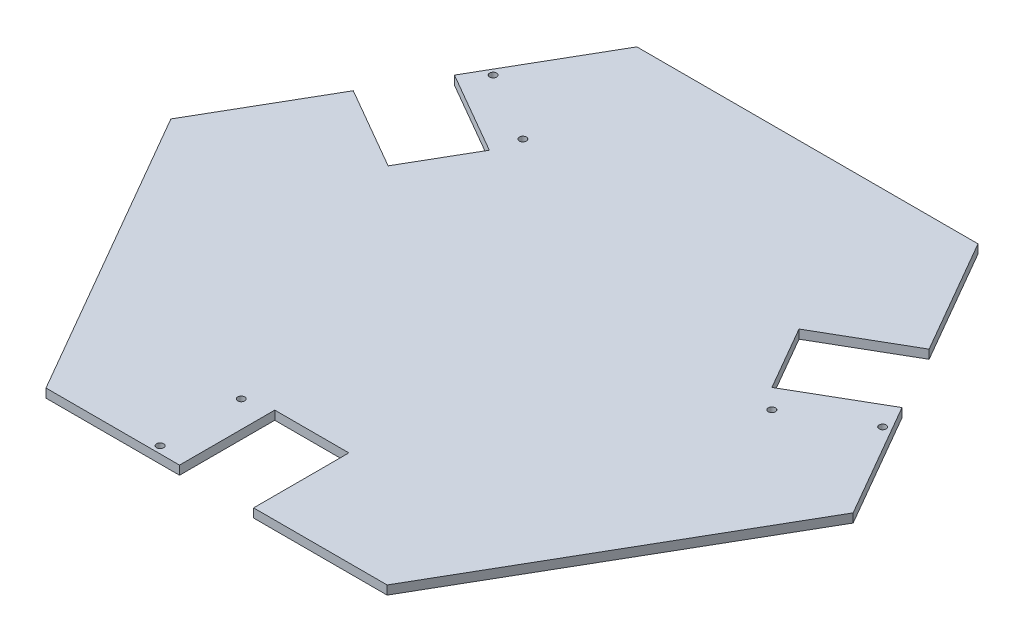
ISO-10303-21;
HEADER;
FILE_DESCRIPTION(('STEP AP214'),'2;1');
FILE_NAME('part.step','',(''),(''),'','','');
FILE_SCHEMA(('AUTOMOTIVE_DESIGN { 1 0 10303 214 1 1 1 1 }'));
ENDSEC;
DATA;
#1=APPLICATION_CONTEXT('core data for automotive mechanical design processes');
#2=APPLICATION_PROTOCOL_DEFINITION('international standard','automotive_design',2000,#1);
#3=PRODUCT_CONTEXT('',#1,'mechanical');
#4=PRODUCT('Part','Part','',(#3));
#5=PRODUCT_RELATED_PRODUCT_CATEGORY('part','',(#4));
#6=PRODUCT_DEFINITION_FORMATION('','',#4);
#7=PRODUCT_DEFINITION_CONTEXT('part definition',#1,'design');
#8=PRODUCT_DEFINITION('design','',#6,#7);
#9=PRODUCT_DEFINITION_SHAPE('','',#8);
#10=(LENGTH_UNIT() NAMED_UNIT(*) SI_UNIT(.MILLI.,.METRE.));
#11=(NAMED_UNIT(*) PLANE_ANGLE_UNIT() SI_UNIT($,.RADIAN.));
#12=(NAMED_UNIT(*) SI_UNIT($,.STERADIAN.) SOLID_ANGLE_UNIT());
#13=UNCERTAINTY_MEASURE_WITH_UNIT(LENGTH_MEASURE(1.E-05),#10,'distance_accuracy_value','');
#14=(GEOMETRIC_REPRESENTATION_CONTEXT(3) GLOBAL_UNCERTAINTY_ASSIGNED_CONTEXT((#13)) GLOBAL_UNIT_ASSIGNED_CONTEXT((#10,
#11,#12)) REPRESENTATION_CONTEXT('',''));
#15=CARTESIAN_POINT('',(0.,0.,0.));
#16=DIRECTION('',(0.,0.,1.));
#17=DIRECTION('',(1.,0.,0.));
#18=AXIS2_PLACEMENT_3D('',#15,#16,#17);
#19=CARTESIAN_POINT('',(21.,5.,-167.5));
#20=DIRECTION('',(0.,-1.,0.));
#21=DIRECTION('',(0.,0.,-1.));
#22=AXIS2_PLACEMENT_3D('',#19,#20,#21);
#23=PLANE('',#22);
#24=CARTESIAN_POINT('',(159.595153518756,5.,-50.5730854637603));
#25=DIRECTION('',(0.,1.,0.));
#26=DIRECTION('',(0.,0.,1.));
#27=AXIS2_PLACEMENT_3D('',#24,#25,#26);
#28=CIRCLE('',#27,2.);
#29=CARTESIAN_POINT('',(159.595153518756,5.,-48.5730854637603));
#30=VERTEX_POINT('',#29);
#31=EDGE_CURVE('E379',#30,#30,#28,.T.);
#32=ORIENTED_EDGE('',*,*,#31,.F.);
#33=EDGE_LOOP('',(#32));
#34=FACE_BOUND('',#33,.T.);
#35=CARTESIAN_POINT('',(-123.595153518756,5.,-112.92691453624));
#36=DIRECTION('',(0.,1.,0.));
#37=DIRECTION('',(0.,0.,1.));
#38=AXIS2_PLACEMENT_3D('',#35,#36,#37);
#39=CIRCLE('',#38,2.);
#40=CARTESIAN_POINT('',(-123.595153518756,5.,-110.92691453624));
#41=VERTEX_POINT('',#40);
#42=EDGE_CURVE('E391',#41,#41,#39,.T.);
#43=ORIENTED_EDGE('',*,*,#42,.F.);
#44=EDGE_LOOP('',(#43));
#45=FACE_BOUND('',#44,.T.);
#46=CARTESIAN_POINT('',(-36.,5.,163.5));
#47=DIRECTION('',(0.,1.,0.));
#48=DIRECTION('',(0.,0.,1.));
#49=AXIS2_PLACEMENT_3D('',#46,#47,#48);
#50=CIRCLE('',#49,2.);
#51=CARTESIAN_POINT('',(-36.,5.,165.5));
#52=VERTEX_POINT('',#51);
#53=EDGE_CURVE('E195',#52,#52,#50,.T.);
#54=ORIENTED_EDGE('',*,*,#53,.F.);
#55=EDGE_LOOP('',(#54));
#56=FACE_BOUND('',#55,.T.);
#57=DIRECTION('',(-1.,0.,0.));
#58=VECTOR('',#57,1.);
#59=CARTESIAN_POINT('',(-96.7061700892624,5.,-167.5));
#60=LINE('',#59,#58);
#61=CARTESIAN_POINT('',(96.7061700892624,5.,-167.5));
#62=VERTEX_POINT('',#61);
#63=CARTESIAN_POINT('',(-96.7061700892624,5.,-167.5));
#64=VERTEX_POINT('',#63);
#65=EDGE_CURVE('E226',#62,#64,#60,.T.);
#66=ORIENTED_EDGE('',*,*,#65,.T.);
#67=DIRECTION('',(-0.5,0.,0.866025403784439));
#68=VECTOR('',#67,1.);
#69=CARTESIAN_POINT('',(-96.7061700892624,5.,-167.5));
#70=LINE('',#69,#68);
#71=CARTESIAN_POINT('',(-134.559255133893,5.,-101.936533479473));
#72=VERTEX_POINT('',#71);
#73=EDGE_CURVE('E124',#64,#72,#70,.T.);
#74=ORIENTED_EDGE('',*,*,#73,.T.);
#75=DIRECTION('',(0.866025403784439,0.,0.5));
#76=VECTOR('',#75,1.);
#77=CARTESIAN_POINT('',(-134.559255133893,5.,-101.936533479473));
#78=LINE('',#77,#76);
#79=CARTESIAN_POINT('',(-87.7938833295337,5.,-74.9365334794733));
#80=VERTEX_POINT('',#79);
#81=EDGE_CURVE('E271',#72,#80,#78,.T.);
#82=ORIENTED_EDGE('',*,*,#81,.T.);
#83=DIRECTION('',(-0.500000000000001,0.,0.866025403784438));
#84=VECTOR('',#83,1.);
#85=CARTESIAN_POINT('',(-87.7938833295337,5.,-74.9365334794733));
#86=LINE('',#85,#84);
#87=CARTESIAN_POINT('',(-108.793883329534,5.,-38.563466520527));
#88=VERTEX_POINT('',#87);
#89=EDGE_CURVE('E290',#80,#88,#86,.T.);
#90=ORIENTED_EDGE('',*,*,#89,.T.);
#91=DIRECTION('',(-0.866025403784439,0.,-0.5));
#92=VECTOR('',#91,1.);
#93=CARTESIAN_POINT('',(-108.793883329534,5.,-38.563466520527));
#94=LINE('',#93,#92);
#95=CARTESIAN_POINT('',(-155.559255133893,5.,-65.563466520527));
#96=VERTEX_POINT('',#95);
#97=EDGE_CURVE('E287',#88,#96,#94,.T.);
#98=ORIENTED_EDGE('',*,*,#97,.T.);
#99=DIRECTION('',(-0.5,0.,0.866025403784439));
#100=VECTOR('',#99,1.);
#101=CARTESIAN_POINT('',(-155.559255133893,5.,-65.563466520527));
#102=LINE('',#101,#100);
#103=CARTESIAN_POINT('',(-193.412340178525,5.,0.));
#104=VERTEX_POINT('',#103);
#105=EDGE_CURVE('E289',#96,#104,#102,.T.);
#106=ORIENTED_EDGE('',*,*,#105,.T.);
#107=DIRECTION('',(0.499999999999999,0.,0.866025403784439));
#108=VECTOR('',#107,1.);
#109=CARTESIAN_POINT('',(-193.412340178525,5.,0.));
#110=LINE('',#109,#108);
#111=CARTESIAN_POINT('',(-96.7061700892624,5.,167.5));
#112=VERTEX_POINT('',#111);
#113=EDGE_CURVE('E292',#104,#112,#110,.T.);
#114=ORIENTED_EDGE('',*,*,#113,.T.);
#115=DIRECTION('',(1.,0.,0.));
#116=VECTOR('',#115,1.);
#117=CARTESIAN_POINT('',(-96.7061700892624,5.,167.5));
#118=LINE('',#117,#116);
#119=CARTESIAN_POINT('',(-21.,5.,167.5));
#120=VERTEX_POINT('',#119);
#121=EDGE_CURVE('E298',#112,#120,#118,.T.);
#122=ORIENTED_EDGE('',*,*,#121,.T.);
#123=DIRECTION('',(0.,0.,-1.));
#124=VECTOR('',#123,1.);
#125=CARTESIAN_POINT('',(-21.,5.,167.5));
#126=LINE('',#125,#124);
#127=CARTESIAN_POINT('',(-21.,5.,113.5));
#128=VERTEX_POINT('',#127);
#129=EDGE_CURVE('E300',#120,#128,#126,.T.);
#130=ORIENTED_EDGE('',*,*,#129,.T.);
#131=DIRECTION('',(1.,0.,0.));
#132=VECTOR('',#131,1.);
#133=CARTESIAN_POINT('',(-21.,5.,113.5));
#134=LINE('',#133,#132);
#135=CARTESIAN_POINT('',(21.,5.,113.5));
#136=VERTEX_POINT('',#135);
#137=EDGE_CURVE('E302',#128,#136,#134,.T.);
#138=ORIENTED_EDGE('',*,*,#137,.T.);
#139=DIRECTION('',(0.,0.,1.));
#140=VECTOR('',#139,1.);
#141=CARTESIAN_POINT('',(21.,5.,113.5));
#142=LINE('',#141,#140);
#143=CARTESIAN_POINT('',(21.,5.,167.5));
#144=VERTEX_POINT('',#143);
#145=EDGE_CURVE('E304',#136,#144,#142,.T.);
#146=ORIENTED_EDGE('',*,*,#145,.T.);
#147=DIRECTION('',(1.,0.,0.));
#148=VECTOR('',#147,1.);
#149=CARTESIAN_POINT('',(21.,5.,167.5));
#150=LINE('',#149,#148);
#151=CARTESIAN_POINT('',(96.7061700892625,5.,167.5));
#152=VERTEX_POINT('',#151);
#153=EDGE_CURVE('E306',#144,#152,#150,.T.);
#154=ORIENTED_EDGE('',*,*,#153,.T.);
#155=DIRECTION('',(0.499999999999999,0.,-0.866025403784439));
#156=VECTOR('',#155,1.);
#157=CARTESIAN_POINT('',(96.7061700892625,5.,167.5));
#158=LINE('',#157,#156);
#159=CARTESIAN_POINT('',(193.412340178525,5.,0.));
#160=VERTEX_POINT('',#159);
#161=EDGE_CURVE('E308',#152,#160,#158,.T.);
#162=ORIENTED_EDGE('',*,*,#161,.T.);
#163=DIRECTION('',(-0.5,0.,-0.866025403784439));
#164=VECTOR('',#163,1.);
#165=CARTESIAN_POINT('',(193.412340178525,5.,0.));
#166=LINE('',#165,#164);
#167=CARTESIAN_POINT('',(155.559255133893,5.,-65.563466520527));
#168=VERTEX_POINT('',#167);
#169=EDGE_CURVE('E310',#160,#168,#166,.T.);
#170=ORIENTED_EDGE('',*,*,#169,.T.);
#171=DIRECTION('',(-0.866025403784439,0.,0.5));
#172=VECTOR('',#171,1.);
#173=CARTESIAN_POINT('',(108.793883329534,5.,-38.563466520527));
#174=LINE('',#173,#172);
#175=CARTESIAN_POINT('',(108.793883329534,5.,-38.563466520527));
#176=VERTEX_POINT('',#175);
#177=EDGE_CURVE('E173',#168,#176,#174,.T.);
#178=ORIENTED_EDGE('',*,*,#177,.T.);
#179=DIRECTION('',(-0.500000000000001,0.,-0.866025403784438));
#180=VECTOR('',#179,1.);
#181=CARTESIAN_POINT('',(87.7938833295337,5.,-74.9365334794733));
#182=LINE('',#181,#180);
#183=CARTESIAN_POINT('',(87.7938833295337,5.,-74.9365334794733));
#184=VERTEX_POINT('',#183);
#185=EDGE_CURVE('E167',#176,#184,#182,.T.);
#186=ORIENTED_EDGE('',*,*,#185,.T.);
#187=DIRECTION('',(0.866025403784439,0.,-0.5));
#188=VECTOR('',#187,1.);
#189=CARTESIAN_POINT('',(134.559255133893,5.,-101.936533479473));
#190=LINE('',#189,#188);
#191=CARTESIAN_POINT('',(134.559255133893,5.,-101.936533479473));
#192=VERTEX_POINT('',#191);
#193=EDGE_CURVE('E171',#184,#192,#190,.T.);
#194=ORIENTED_EDGE('',*,*,#193,.T.);
#195=DIRECTION('',(-0.5,0.,-0.866025403784439));
#196=VECTOR('',#195,1.);
#197=CARTESIAN_POINT('',(134.559255133893,5.,-101.936533479473));
#198=LINE('',#197,#196);
#199=EDGE_CURVE('E51',#192,#62,#198,.T.);
#200=ORIENTED_EDGE('',*,*,#199,.T.);
#201=EDGE_LOOP('',(#66,#74,#82,#90,#98,#106,#114,#122,#130,#138,#146,#154,#162,#170,#178,#186,
#194,#200));
#202=FACE_BOUND('',#201,.T.);
#203=CARTESIAN_POINT('',(-36.,5.,117.5));
#204=DIRECTION('',(0.,1.,0.));
#205=DIRECTION('',(0.,0.,1.));
#206=AXIS2_PLACEMENT_3D('',#203,#204,#205);
#207=CIRCLE('',#206,2.);
#208=CARTESIAN_POINT('',(-36.,5.,119.5));
#209=VERTEX_POINT('',#208);
#210=EDGE_CURVE('E397',#209,#209,#207,.T.);
#211=ORIENTED_EDGE('',*,*,#210,.F.);
#212=EDGE_LOOP('',(#211));
#213=FACE_BOUND('',#212,.T.);
#214=CARTESIAN_POINT('',(-83.7579849446715,5.,-89.9269145362397));
#215=DIRECTION('',(0.,1.,0.));
#216=DIRECTION('',(0.,0.,1.));
#217=AXIS2_PLACEMENT_3D('',#214,#215,#216);
#218=CIRCLE('',#217,2.00000000000003);
#219=CARTESIAN_POINT('',(-83.7579849446715,5.,-87.9269145362397));
#220=VERTEX_POINT('',#219);
#221=EDGE_CURVE('E385',#220,#220,#218,.T.);
#222=ORIENTED_EDGE('',*,*,#221,.F.);
#223=EDGE_LOOP('',(#222));
#224=FACE_BOUND('',#223,.T.);
#225=CARTESIAN_POINT('',(119.757984944671,5.,-27.5730854637603));
#226=DIRECTION('',(0.,1.,0.));
#227=DIRECTION('',(0.,0.,1.));
#228=AXIS2_PLACEMENT_3D('',#225,#226,#227);
#229=CIRCLE('',#228,2.);
#230=CARTESIAN_POINT('',(119.757984944671,5.,-25.5730854637603));
#231=VERTEX_POINT('',#230);
#232=EDGE_CURVE('E370',#231,#231,#229,.T.);
#233=ORIENTED_EDGE('',*,*,#232,.F.);
#234=EDGE_LOOP('',(#233));
#235=FACE_BOUND('',#234,.T.);
#236=ADVANCED_FACE('F34',(#34,#45,#56,#202,#213,#224,#235),#23,.F.);
#237=CARTESIAN_POINT('',(21.,0.,-167.5));
#238=DIRECTION('',(0.,-1.,0.));
#239=DIRECTION('',(0.,0.,-1.));
#240=AXIS2_PLACEMENT_3D('',#237,#238,#239);
#241=PLANE('',#240);
#242=CARTESIAN_POINT('',(159.595153518756,0.,-50.5730854637603));
#243=DIRECTION('',(0.,1.,0.));
#244=DIRECTION('',(0.,0.,1.));
#245=AXIS2_PLACEMENT_3D('',#242,#243,#244);
#246=CIRCLE('',#245,2.);
#247=CARTESIAN_POINT('',(159.595153518756,0.,-48.5730854637603));
#248=VERTEX_POINT('',#247);
#249=EDGE_CURVE('E376',#248,#248,#246,.T.);
#250=ORIENTED_EDGE('',*,*,#249,.T.);
#251=EDGE_LOOP('',(#250));
#252=FACE_BOUND('',#251,.T.);
#253=CARTESIAN_POINT('',(-123.595153518756,0.,-112.92691453624));
#254=DIRECTION('',(0.,1.,0.));
#255=DIRECTION('',(0.,0.,1.));
#256=AXIS2_PLACEMENT_3D('',#253,#254,#255);
#257=CIRCLE('',#256,2.);
#258=CARTESIAN_POINT('',(-123.595153518756,0.,-110.92691453624));
#259=VERTEX_POINT('',#258);
#260=EDGE_CURVE('E388',#259,#259,#257,.T.);
#261=ORIENTED_EDGE('',*,*,#260,.T.);
#262=EDGE_LOOP('',(#261));
#263=FACE_BOUND('',#262,.T.);
#264=CARTESIAN_POINT('',(-36.,0.,163.5));
#265=DIRECTION('',(0.,1.,0.));
#266=DIRECTION('',(0.,0.,1.));
#267=AXIS2_PLACEMENT_3D('',#264,#265,#266);
#268=CIRCLE('',#267,2.);
#269=CARTESIAN_POINT('',(-36.,0.,165.5));
#270=VERTEX_POINT('',#269);
#271=EDGE_CURVE('E400',#270,#270,#268,.T.);
#272=ORIENTED_EDGE('',*,*,#271,.T.);
#273=EDGE_LOOP('',(#272));
#274=FACE_BOUND('',#273,.T.);
#275=DIRECTION('',(-1.,0.,0.));
#276=VECTOR('',#275,1.);
#277=CARTESIAN_POINT('',(-96.7061700892624,0.,-167.5));
#278=LINE('',#277,#276);
#279=CARTESIAN_POINT('',(96.7061700892624,0.,-167.5));
#280=VERTEX_POINT('',#279);
#281=CARTESIAN_POINT('',(-96.7061700892624,0.,-167.5));
#282=VERTEX_POINT('',#281);
#283=EDGE_CURVE('E191',#280,#282,#278,.T.);
#284=ORIENTED_EDGE('',*,*,#283,.F.);
#285=DIRECTION('',(-0.5,0.,-0.866025403784439));
#286=VECTOR('',#285,1.);
#287=CARTESIAN_POINT('',(134.559255133893,0.,-101.936533479473));
#288=LINE('',#287,#286);
#289=CARTESIAN_POINT('',(134.559255133893,0.,-101.936533479473));
#290=VERTEX_POINT('',#289);
#291=EDGE_CURVE('E116',#290,#280,#288,.T.);
#292=ORIENTED_EDGE('',*,*,#291,.F.);
#293=DIRECTION('',(0.866025403784439,0.,-0.5));
#294=VECTOR('',#293,1.);
#295=CARTESIAN_POINT('',(134.559255133893,0.,-101.936533479473));
#296=LINE('',#295,#294);
#297=CARTESIAN_POINT('',(87.7938833295337,0.,-74.9365334794733));
#298=VERTEX_POINT('',#297);
#299=EDGE_CURVE('E110',#298,#290,#296,.T.);
#300=ORIENTED_EDGE('',*,*,#299,.F.);
#301=DIRECTION('',(-0.500000000000001,0.,-0.866025403784438));
#302=VECTOR('',#301,1.);
#303=CARTESIAN_POINT('',(87.7938833295337,0.,-74.9365334794733));
#304=LINE('',#303,#302);
#305=CARTESIAN_POINT('',(108.793883329534,0.,-38.563466520527));
#306=VERTEX_POINT('',#305);
#307=EDGE_CURVE('E181',#306,#298,#304,.T.);
#308=ORIENTED_EDGE('',*,*,#307,.F.);
#309=DIRECTION('',(-0.866025403784439,0.,0.5));
#310=VECTOR('',#309,1.);
#311=CARTESIAN_POINT('',(108.793883329534,0.,-38.563466520527));
#312=LINE('',#311,#310);
#313=CARTESIAN_POINT('',(155.559255133893,0.,-65.563466520527));
#314=VERTEX_POINT('',#313);
#315=EDGE_CURVE('E221',#314,#306,#312,.T.);
#316=ORIENTED_EDGE('',*,*,#315,.F.);
#317=DIRECTION('',(-0.5,0.,-0.866025403784439));
#318=VECTOR('',#317,1.);
#319=CARTESIAN_POINT('',(193.412340178525,0.,0.));
#320=LINE('',#319,#318);
#321=CARTESIAN_POINT('',(193.412340178525,0.,0.));
#322=VERTEX_POINT('',#321);
#323=EDGE_CURVE('E219',#322,#314,#320,.T.);
#324=ORIENTED_EDGE('',*,*,#323,.F.);
#325=DIRECTION('',(0.499999999999999,0.,-0.866025403784439));
#326=VECTOR('',#325,1.);
#327=CARTESIAN_POINT('',(96.7061700892625,0.,167.5));
#328=LINE('',#327,#326);
#329=CARTESIAN_POINT('',(96.7061700892625,0.,167.5));
#330=VERTEX_POINT('',#329);
#331=EDGE_CURVE('E217',#330,#322,#328,.T.);
#332=ORIENTED_EDGE('',*,*,#331,.F.);
#333=DIRECTION('',(1.,0.,0.));
#334=VECTOR('',#333,1.);
#335=CARTESIAN_POINT('',(21.,0.,167.5));
#336=LINE('',#335,#334);
#337=CARTESIAN_POINT('',(21.,0.,167.5));
#338=VERTEX_POINT('',#337);
#339=EDGE_CURVE('E215',#338,#330,#336,.T.);
#340=ORIENTED_EDGE('',*,*,#339,.F.);
#341=DIRECTION('',(0.,0.,1.));
#342=VECTOR('',#341,1.);
#343=CARTESIAN_POINT('',(21.,0.,113.5));
#344=LINE('',#343,#342);
#345=CARTESIAN_POINT('',(21.,0.,113.5));
#346=VERTEX_POINT('',#345);
#347=EDGE_CURVE('E213',#346,#338,#344,.T.);
#348=ORIENTED_EDGE('',*,*,#347,.F.);
#349=DIRECTION('',(1.,0.,0.));
#350=VECTOR('',#349,1.);
#351=CARTESIAN_POINT('',(-21.,0.,113.5));
#352=LINE('',#351,#350);
#353=CARTESIAN_POINT('',(-21.,0.,113.5));
#354=VERTEX_POINT('',#353);
#355=EDGE_CURVE('E211',#354,#346,#352,.T.);
#356=ORIENTED_EDGE('',*,*,#355,.F.);
#357=DIRECTION('',(0.,0.,-1.));
#358=VECTOR('',#357,1.);
#359=CARTESIAN_POINT('',(-21.,0.,167.5));
#360=LINE('',#359,#358);
#361=CARTESIAN_POINT('',(-21.,0.,167.5));
#362=VERTEX_POINT('',#361);
#363=EDGE_CURVE('E209',#362,#354,#360,.T.);
#364=ORIENTED_EDGE('',*,*,#363,.F.);
#365=DIRECTION('',(1.,0.,0.));
#366=VECTOR('',#365,1.);
#367=CARTESIAN_POINT('',(-96.7061700892624,0.,167.5));
#368=LINE('',#367,#366);
#369=CARTESIAN_POINT('',(-96.7061700892624,0.,167.5));
#370=VERTEX_POINT('',#369);
#371=EDGE_CURVE('E207',#370,#362,#368,.T.);
#372=ORIENTED_EDGE('',*,*,#371,.F.);
#373=DIRECTION('',(0.499999999999999,0.,0.866025403784439));
#374=VECTOR('',#373,1.);
#375=CARTESIAN_POINT('',(-193.412340178525,0.,0.));
#376=LINE('',#375,#374);
#377=CARTESIAN_POINT('',(-193.412340178525,0.,0.));
#378=VERTEX_POINT('',#377);
#379=EDGE_CURVE('E205',#378,#370,#376,.T.);
#380=ORIENTED_EDGE('',*,*,#379,.F.);
#381=DIRECTION('',(-0.5,0.,0.866025403784439));
#382=VECTOR('',#381,1.);
#383=CARTESIAN_POINT('',(-155.559255133893,0.,-65.563466520527));
#384=LINE('',#383,#382);
#385=CARTESIAN_POINT('',(-155.559255133893,0.,-65.563466520527));
#386=VERTEX_POINT('',#385);
#387=EDGE_CURVE('E203',#386,#378,#384,.T.);
#388=ORIENTED_EDGE('',*,*,#387,.F.);
#389=DIRECTION('',(-0.866025403784439,0.,-0.5));
#390=VECTOR('',#389,1.);
#391=CARTESIAN_POINT('',(-108.793883329534,0.,-38.563466520527));
#392=LINE('',#391,#390);
#393=CARTESIAN_POINT('',(-108.793883329534,0.,-38.563466520527));
#394=VERTEX_POINT('',#393);
#395=EDGE_CURVE('E201',#394,#386,#392,.T.);
#396=ORIENTED_EDGE('',*,*,#395,.F.);
#397=DIRECTION('',(-0.500000000000001,0.,0.866025403784438));
#398=VECTOR('',#397,1.);
#399=CARTESIAN_POINT('',(-87.7938833295337,0.,-74.9365334794733));
#400=LINE('',#399,#398);
#401=CARTESIAN_POINT('',(-87.7938833295337,0.,-74.9365334794733));
#402=VERTEX_POINT('',#401);
#403=EDGE_CURVE('E199',#402,#394,#400,.T.);
#404=ORIENTED_EDGE('',*,*,#403,.F.);
#405=DIRECTION('',(0.866025403784439,0.,0.5));
#406=VECTOR('',#405,1.);
#407=CARTESIAN_POINT('',(-134.559255133893,0.,-101.936533479473));
#408=LINE('',#407,#406);
#409=CARTESIAN_POINT('',(-134.559255133893,0.,-101.936533479473));
#410=VERTEX_POINT('',#409);
#411=EDGE_CURVE('E197',#410,#402,#408,.T.);
#412=ORIENTED_EDGE('',*,*,#411,.F.);
#413=DIRECTION('',(-0.5,0.,0.866025403784439));
#414=VECTOR('',#413,1.);
#415=CARTESIAN_POINT('',(-96.7061700892624,0.,-167.5));
#416=LINE('',#415,#414);
#417=EDGE_CURVE('E194',#282,#410,#416,.T.);
#418=ORIENTED_EDGE('',*,*,#417,.F.);
#419=EDGE_LOOP('',(#284,#292,#300,#308,#316,#324,#332,#340,#348,#356,#364,#372,#380,#388,#396,
#404,#412,#418));
#420=FACE_BOUND('',#419,.T.);
#421=CARTESIAN_POINT('',(-36.,0.,117.5));
#422=DIRECTION('',(0.,1.,0.));
#423=DIRECTION('',(0.,0.,1.));
#424=AXIS2_PLACEMENT_3D('',#421,#422,#423);
#425=CIRCLE('',#424,2.);
#426=CARTESIAN_POINT('',(-36.,0.,119.5));
#427=VERTEX_POINT('',#426);
#428=EDGE_CURVE('E394',#427,#427,#425,.T.);
#429=ORIENTED_EDGE('',*,*,#428,.T.);
#430=EDGE_LOOP('',(#429));
#431=FACE_BOUND('',#430,.T.);
#432=CARTESIAN_POINT('',(-83.7579849446715,0.,-89.9269145362397));
#433=DIRECTION('',(0.,1.,0.));
#434=DIRECTION('',(0.,0.,1.));
#435=AXIS2_PLACEMENT_3D('',#432,#433,#434);
#436=CIRCLE('',#435,2.00000000000003);
#437=CARTESIAN_POINT('',(-83.7579849446715,0.,-87.9269145362397));
#438=VERTEX_POINT('',#437);
#439=EDGE_CURVE('E382',#438,#438,#436,.T.);
#440=ORIENTED_EDGE('',*,*,#439,.T.);
#441=EDGE_LOOP('',(#440));
#442=FACE_BOUND('',#441,.T.);
#443=CARTESIAN_POINT('',(119.757984944671,0.,-27.5730854637603));
#444=DIRECTION('',(0.,1.,0.));
#445=DIRECTION('',(0.,0.,1.));
#446=AXIS2_PLACEMENT_3D('',#443,#444,#445);
#447=CIRCLE('',#446,2.);
#448=CARTESIAN_POINT('',(119.757984944671,0.,-25.5730854637603));
#449=VERTEX_POINT('',#448);
#450=EDGE_CURVE('E373',#449,#449,#447,.T.);
#451=ORIENTED_EDGE('',*,*,#450,.T.);
#452=EDGE_LOOP('',(#451));
#453=FACE_BOUND('',#452,.T.);
#454=ADVANCED_FACE('F275',(#252,#263,#274,#420,#431,#442,#453),#241,.T.);
#455=CARTESIAN_POINT('',(-96.7061700892624,5.,-167.5));
#456=DIRECTION('',(0.,0.,1.));
#457=DIRECTION('',(1.,0.,0.));
#458=AXIS2_PLACEMENT_3D('',#455,#456,#457);
#459=PLANE('',#458);
#460=ORIENTED_EDGE('',*,*,#283,.T.);
#461=DIRECTION('',(0.,-1.,0.));
#462=VECTOR('',#461,1.);
#463=CARTESIAN_POINT('',(-96.7061700892624,5.,-167.5));
#464=LINE('',#463,#462);
#465=EDGE_CURVE('E11',#64,#282,#464,.T.);
#466=ORIENTED_EDGE('',*,*,#465,.F.);
#467=ORIENTED_EDGE('',*,*,#65,.F.);
#468=DIRECTION('',(0.,-1.,0.));
#469=VECTOR('',#468,1.);
#470=CARTESIAN_POINT('',(96.7061700892624,5.,-167.5));
#471=LINE('',#470,#469);
#472=EDGE_CURVE('E187',#62,#280,#471,.T.);
#473=ORIENTED_EDGE('',*,*,#472,.T.);
#474=EDGE_LOOP('',(#460,#466,#467,#473));
#475=FACE_BOUND('',#474,.T.);
#476=ADVANCED_FACE('F36',(#475),#459,.F.);
#477=CARTESIAN_POINT('',(-96.7061700892624,5.,-167.5));
#478=DIRECTION('',(0.866025403784439,0.,0.5));
#479=DIRECTION('',(0.5,0.,-0.866025403784439));
#480=AXIS2_PLACEMENT_3D('',#477,#478,#479);
#481=PLANE('',#480);
#482=ORIENTED_EDGE('',*,*,#417,.T.);
#483=DIRECTION('',(0.,-1.,0.));
#484=VECTOR('',#483,1.);
#485=CARTESIAN_POINT('',(-134.559255133893,5.,-101.936533479473));
#486=LINE('',#485,#484);
#487=EDGE_CURVE('E43',#72,#410,#486,.T.);
#488=ORIENTED_EDGE('',*,*,#487,.F.);
#489=ORIENTED_EDGE('',*,*,#73,.F.);
#490=ORIENTED_EDGE('',*,*,#465,.T.);
#491=EDGE_LOOP('',(#482,#488,#489,#490));
#492=FACE_BOUND('',#491,.T.);
#493=ADVANCED_FACE('F587',(#492),#481,.F.);
#494=CARTESIAN_POINT('',(-134.559255133893,5.,-101.936533479473));
#495=DIRECTION('',(0.5,0.,-0.866025403784439));
#496=DIRECTION('',(-0.866025403784439,0.,-0.5));
#497=AXIS2_PLACEMENT_3D('',#494,#495,#496);
#498=PLANE('',#497);
#499=ORIENTED_EDGE('',*,*,#411,.T.);
#500=DIRECTION('',(0.,-1.,0.));
#501=VECTOR('',#500,1.);
#502=CARTESIAN_POINT('',(-87.7938833295337,5.,-74.9365334794733));
#503=LINE('',#502,#501);
#504=EDGE_CURVE('E263',#80,#402,#503,.T.);
#505=ORIENTED_EDGE('',*,*,#504,.F.);
#506=ORIENTED_EDGE('',*,*,#81,.F.);
#507=ORIENTED_EDGE('',*,*,#487,.T.);
#508=EDGE_LOOP('',(#499,#505,#506,#507));
#509=FACE_BOUND('',#508,.T.);
#510=ADVANCED_FACE('F269',(#509),#498,.F.);
#511=CARTESIAN_POINT('',(-87.7938833295337,5.,-74.9365334794733));
#512=DIRECTION('',(0.866025403784438,0.,0.500000000000001));
#513=DIRECTION('',(0.500000000000001,0.,-0.866025403784438));
#514=AXIS2_PLACEMENT_3D('',#511,#512,#513);
#515=PLANE('',#514);
#516=ORIENTED_EDGE('',*,*,#403,.T.);
#517=DIRECTION('',(0.,-1.,0.));
#518=VECTOR('',#517,1.);
#519=CARTESIAN_POINT('',(-108.793883329534,5.,-38.563466520527));
#520=LINE('',#519,#518);
#521=EDGE_CURVE('E260',#88,#394,#520,.T.);
#522=ORIENTED_EDGE('',*,*,#521,.F.);
#523=ORIENTED_EDGE('',*,*,#89,.F.);
#524=ORIENTED_EDGE('',*,*,#504,.T.);
#525=EDGE_LOOP('',(#516,#522,#523,#524));
#526=FACE_BOUND('',#525,.T.);
#527=ADVANCED_FACE('F281',(#526),#515,.F.);
#528=CARTESIAN_POINT('',(-108.793883329534,5.,-38.563466520527));
#529=DIRECTION('',(-0.5,0.,0.866025403784438));
#530=DIRECTION('',(0.866025403784439,0.,0.5));
#531=AXIS2_PLACEMENT_3D('',#528,#529,#530);
#532=PLANE('',#531);
#533=ORIENTED_EDGE('',*,*,#395,.T.);
#534=DIRECTION('',(0.,-1.,0.));
#535=VECTOR('',#534,1.);
#536=CARTESIAN_POINT('',(-155.559255133893,5.,-65.563466520527));
#537=LINE('',#536,#535);
#538=EDGE_CURVE('E257',#96,#386,#537,.T.);
#539=ORIENTED_EDGE('',*,*,#538,.F.);
#540=ORIENTED_EDGE('',*,*,#97,.F.);
#541=ORIENTED_EDGE('',*,*,#521,.T.);
#542=EDGE_LOOP('',(#533,#539,#540,#541));
#543=FACE_BOUND('',#542,.T.);
#544=ADVANCED_FACE('F285',(#543),#532,.F.);
#545=CARTESIAN_POINT('',(-155.559255133893,5.,-65.563466520527));
#546=DIRECTION('',(0.866025403784439,0.,0.5));
#547=DIRECTION('',(0.5,0.,-0.866025403784439));
#548=AXIS2_PLACEMENT_3D('',#545,#546,#547);
#549=PLANE('',#548);
#550=ORIENTED_EDGE('',*,*,#387,.T.);
#551=DIRECTION('',(0.,-1.,0.));
#552=VECTOR('',#551,1.);
#553=CARTESIAN_POINT('',(-193.412340178525,5.,0.));
#554=LINE('',#553,#552);
#555=EDGE_CURVE('E254',#104,#378,#554,.T.);
#556=ORIENTED_EDGE('',*,*,#555,.F.);
#557=ORIENTED_EDGE('',*,*,#105,.F.);
#558=ORIENTED_EDGE('',*,*,#538,.T.);
#559=EDGE_LOOP('',(#550,#556,#557,#558));
#560=FACE_BOUND('',#559,.T.);
#561=ADVANCED_FACE('F552',(#560),#549,.F.);
#562=CARTESIAN_POINT('',(-193.412340178525,5.,0.));
#563=DIRECTION('',(0.866025403784439,0.,-0.499999999999999));
#564=DIRECTION('',(-0.499999999999999,0.,-0.866025403784439));
#565=AXIS2_PLACEMENT_3D('',#562,#563,#564);
#566=PLANE('',#565);
#567=ORIENTED_EDGE('',*,*,#379,.T.);
#568=DIRECTION('',(0.,-1.,0.));
#569=VECTOR('',#568,1.);
#570=CARTESIAN_POINT('',(-96.7061700892624,5.,167.5));
#571=LINE('',#570,#569);
#572=EDGE_CURVE('E251',#112,#370,#571,.T.);
#573=ORIENTED_EDGE('',*,*,#572,.F.);
#574=ORIENTED_EDGE('',*,*,#113,.F.);
#575=ORIENTED_EDGE('',*,*,#555,.T.);
#576=EDGE_LOOP('',(#567,#573,#574,#575));
#577=FACE_BOUND('',#576,.T.);
#578=ADVANCED_FACE('F542',(#577),#566,.F.);
#579=CARTESIAN_POINT('',(-96.7061700892624,5.,167.5));
#580=DIRECTION('',(0.,0.,-1.));
#581=DIRECTION('',(-1.,0.,0.));
#582=AXIS2_PLACEMENT_3D('',#579,#580,#581);
#583=PLANE('',#582);
#584=ORIENTED_EDGE('',*,*,#371,.T.);
#585=DIRECTION('',(0.,-1.,0.));
#586=VECTOR('',#585,1.);
#587=CARTESIAN_POINT('',(-21.,5.,167.5));
#588=LINE('',#587,#586);
#589=EDGE_CURVE('E248',#120,#362,#588,.T.);
#590=ORIENTED_EDGE('',*,*,#589,.F.);
#591=ORIENTED_EDGE('',*,*,#121,.F.);
#592=ORIENTED_EDGE('',*,*,#572,.T.);
#593=EDGE_LOOP('',(#584,#590,#591,#592));
#594=FACE_BOUND('',#593,.T.);
#595=ADVANCED_FACE('F532',(#594),#583,.F.);
#596=CARTESIAN_POINT('',(-21.,5.,167.5));
#597=DIRECTION('',(-1.,0.,0.));
#598=DIRECTION('',(0.,0.,1.));
#599=AXIS2_PLACEMENT_3D('',#596,#597,#598);
#600=PLANE('',#599);
#601=ORIENTED_EDGE('',*,*,#363,.T.);
#602=DIRECTION('',(0.,-1.,0.));
#603=VECTOR('',#602,1.);
#604=CARTESIAN_POINT('',(-21.,5.,113.5));
#605=LINE('',#604,#603);
#606=EDGE_CURVE('E245',#128,#354,#605,.T.);
#607=ORIENTED_EDGE('',*,*,#606,.F.);
#608=ORIENTED_EDGE('',*,*,#129,.F.);
#609=ORIENTED_EDGE('',*,*,#589,.T.);
#610=EDGE_LOOP('',(#601,#607,#608,#609));
#611=FACE_BOUND('',#610,.T.);
#612=ADVANCED_FACE('F522',(#611),#600,.F.);
#613=CARTESIAN_POINT('',(-21.,5.,113.5));
#614=DIRECTION('',(0.,0.,-1.));
#615=DIRECTION('',(-1.,0.,0.));
#616=AXIS2_PLACEMENT_3D('',#613,#614,#615);
#617=PLANE('',#616);
#618=ORIENTED_EDGE('',*,*,#355,.T.);
#619=DIRECTION('',(0.,-1.,0.));
#620=VECTOR('',#619,1.);
#621=CARTESIAN_POINT('',(21.,5.,113.5));
#622=LINE('',#621,#620);
#623=EDGE_CURVE('E242',#136,#346,#622,.T.);
#624=ORIENTED_EDGE('',*,*,#623,.F.);
#625=ORIENTED_EDGE('',*,*,#137,.F.);
#626=ORIENTED_EDGE('',*,*,#606,.T.);
#627=EDGE_LOOP('',(#618,#624,#625,#626));
#628=FACE_BOUND('',#627,.T.);
#629=ADVANCED_FACE('F512',(#628),#617,.F.);
#630=CARTESIAN_POINT('',(21.,5.,113.5));
#631=DIRECTION('',(1.,0.,0.));
#632=DIRECTION('',(0.,0.,-1.));
#633=AXIS2_PLACEMENT_3D('',#630,#631,#632);
#634=PLANE('',#633);
#635=ORIENTED_EDGE('',*,*,#347,.T.);
#636=DIRECTION('',(0.,-1.,0.));
#637=VECTOR('',#636,1.);
#638=CARTESIAN_POINT('',(21.,5.,167.5));
#639=LINE('',#638,#637);
#640=EDGE_CURVE('E239',#144,#338,#639,.T.);
#641=ORIENTED_EDGE('',*,*,#640,.F.);
#642=ORIENTED_EDGE('',*,*,#145,.F.);
#643=ORIENTED_EDGE('',*,*,#623,.T.);
#644=EDGE_LOOP('',(#635,#641,#642,#643));
#645=FACE_BOUND('',#644,.T.);
#646=ADVANCED_FACE('F502',(#645),#634,.F.);
#647=CARTESIAN_POINT('',(21.,5.,167.5));
#648=DIRECTION('',(0.,0.,-1.));
#649=DIRECTION('',(-1.,0.,0.));
#650=AXIS2_PLACEMENT_3D('',#647,#648,#649);
#651=PLANE('',#650);
#652=ORIENTED_EDGE('',*,*,#339,.T.);
#653=DIRECTION('',(0.,-1.,0.));
#654=VECTOR('',#653,1.);
#655=CARTESIAN_POINT('',(96.7061700892625,5.,167.5));
#656=LINE('',#655,#654);
#657=EDGE_CURVE('E236',#152,#330,#656,.T.);
#658=ORIENTED_EDGE('',*,*,#657,.F.);
#659=ORIENTED_EDGE('',*,*,#153,.F.);
#660=ORIENTED_EDGE('',*,*,#640,.T.);
#661=EDGE_LOOP('',(#652,#658,#659,#660));
#662=FACE_BOUND('',#661,.T.);
#663=ADVANCED_FACE('F492',(#662),#651,.F.);
#664=CARTESIAN_POINT('',(96.7061700892625,5.,167.5));
#665=DIRECTION('',(-0.866025403784439,0.,-0.499999999999999));
#666=DIRECTION('',(-0.499999999999999,0.,0.866025403784439));
#667=AXIS2_PLACEMENT_3D('',#664,#665,#666);
#668=PLANE('',#667);
#669=ORIENTED_EDGE('',*,*,#331,.T.);
#670=DIRECTION('',(0.,-1.,0.));
#671=VECTOR('',#670,1.);
#672=CARTESIAN_POINT('',(193.412340178525,5.,0.));
#673=LINE('',#672,#671);
#674=EDGE_CURVE('E233',#160,#322,#673,.T.);
#675=ORIENTED_EDGE('',*,*,#674,.F.);
#676=ORIENTED_EDGE('',*,*,#161,.F.);
#677=ORIENTED_EDGE('',*,*,#657,.T.);
#678=EDGE_LOOP('',(#669,#675,#676,#677));
#679=FACE_BOUND('',#678,.T.);
#680=ADVANCED_FACE('F483',(#679),#668,.F.);
#681=CARTESIAN_POINT('',(193.412340178525,5.,0.));
#682=DIRECTION('',(-0.866025403784439,0.,0.5));
#683=DIRECTION('',(0.5,0.,0.866025403784439));
#684=AXIS2_PLACEMENT_3D('',#681,#682,#683);
#685=PLANE('',#684);
#686=ORIENTED_EDGE('',*,*,#323,.T.);
#687=DIRECTION('',(0.,-1.,0.));
#688=VECTOR('',#687,1.);
#689=CARTESIAN_POINT('',(155.559255133893,5.,-65.563466520527));
#690=LINE('',#689,#688);
#691=EDGE_CURVE('E230',#168,#314,#690,.T.);
#692=ORIENTED_EDGE('',*,*,#691,.F.);
#693=ORIENTED_EDGE('',*,*,#169,.F.);
#694=ORIENTED_EDGE('',*,*,#674,.T.);
#695=EDGE_LOOP('',(#686,#692,#693,#694));
#696=FACE_BOUND('',#695,.T.);
#697=ADVANCED_FACE('F316',(#696),#685,.F.);
#698=CARTESIAN_POINT('',(108.793883329534,5.,-38.563466520527));
#699=DIRECTION('',(0.5,0.,0.866025403784438));
#700=DIRECTION('',(0.866025403784439,0.,-0.5));
#701=AXIS2_PLACEMENT_3D('',#698,#699,#700);
#702=PLANE('',#701);
#703=ORIENTED_EDGE('',*,*,#315,.T.);
#704=DIRECTION('',(0.,-1.,0.));
#705=VECTOR('',#704,1.);
#706=CARTESIAN_POINT('',(108.793883329534,5.,-38.563466520527));
#707=LINE('',#706,#705);
#708=EDGE_CURVE('E182',#176,#306,#707,.T.);
#709=ORIENTED_EDGE('',*,*,#708,.F.);
#710=ORIENTED_EDGE('',*,*,#177,.F.);
#711=ORIENTED_EDGE('',*,*,#691,.T.);
#712=EDGE_LOOP('',(#703,#709,#710,#711));
#713=FACE_BOUND('',#712,.T.);
#714=ADVANCED_FACE('F320',(#713),#702,.F.);
#715=CARTESIAN_POINT('',(87.7938833295337,5.,-74.9365334794733));
#716=DIRECTION('',(-0.866025403784438,0.,0.500000000000001));
#717=DIRECTION('',(0.500000000000001,0.,0.866025403784438));
#718=AXIS2_PLACEMENT_3D('',#715,#716,#717);
#719=PLANE('',#718);
#720=ORIENTED_EDGE('',*,*,#307,.T.);
#721=DIRECTION('',(0.,-1.,0.));
#722=VECTOR('',#721,1.);
#723=CARTESIAN_POINT('',(87.7938833295337,5.,-74.9365334794733));
#724=LINE('',#723,#722);
#725=EDGE_CURVE('E178',#184,#298,#724,.T.);
#726=ORIENTED_EDGE('',*,*,#725,.F.);
#727=ORIENTED_EDGE('',*,*,#185,.F.);
#728=ORIENTED_EDGE('',*,*,#708,.T.);
#729=EDGE_LOOP('',(#720,#726,#727,#728));
#730=FACE_BOUND('',#729,.T.);
#731=ADVANCED_FACE('F179',(#730),#719,.F.);
#732=CARTESIAN_POINT('',(134.559255133893,5.,-101.936533479473));
#733=DIRECTION('',(-0.5,0.,-0.866025403784439));
#734=DIRECTION('',(-0.866025403784439,0.,0.5));
#735=AXIS2_PLACEMENT_3D('',#732,#733,#734);
#736=PLANE('',#735);
#737=ORIENTED_EDGE('',*,*,#299,.T.);
#738=DIRECTION('',(0.,-1.,0.));
#739=VECTOR('',#738,1.);
#740=CARTESIAN_POINT('',(134.559255133893,5.,-101.936533479473));
#741=LINE('',#740,#739);
#742=EDGE_CURVE('E183',#192,#290,#741,.T.);
#743=ORIENTED_EDGE('',*,*,#742,.F.);
#744=ORIENTED_EDGE('',*,*,#193,.F.);
#745=ORIENTED_EDGE('',*,*,#725,.T.);
#746=EDGE_LOOP('',(#737,#743,#744,#745));
#747=FACE_BOUND('',#746,.T.);
#748=ADVANCED_FACE('F185',(#747),#736,.F.);
#749=CARTESIAN_POINT('',(134.559255133893,5.,-101.936533479473));
#750=DIRECTION('',(-0.866025403784439,0.,0.5));
#751=DIRECTION('',(0.5,0.,0.866025403784439));
#752=AXIS2_PLACEMENT_3D('',#749,#750,#751);
#753=PLANE('',#752);
#754=ORIENTED_EDGE('',*,*,#291,.T.);
#755=ORIENTED_EDGE('',*,*,#472,.F.);
#756=ORIENTED_EDGE('',*,*,#199,.F.);
#757=ORIENTED_EDGE('',*,*,#742,.T.);
#758=EDGE_LOOP('',(#754,#755,#756,#757));
#759=FACE_BOUND('',#758,.T.);
#760=ADVANCED_FACE('F324',(#759),#753,.F.);
#761=CARTESIAN_POINT('',(-36.,5.,163.5));
#762=DIRECTION('',(0.,-1.,0.));
#763=DIRECTION('',(0.,0.,-1.));
#764=AXIS2_PLACEMENT_3D('',#761,#762,#763);
#765=CYLINDRICAL_SURFACE('',#764,2.);
#766=ORIENTED_EDGE('',*,*,#53,.T.);
#767=EDGE_LOOP('',(#766));
#768=FACE_BOUND('',#767,.T.);
#769=ORIENTED_EDGE('',*,*,#271,.F.);
#770=EDGE_LOOP('',(#769));
#771=FACE_BOUND('',#770,.T.);
#772=ADVANCED_FACE('F326',(#768,#771),#765,.F.);
#773=CARTESIAN_POINT('',(-36.,5.,117.5));
#774=DIRECTION('',(0.,-1.,0.));
#775=DIRECTION('',(0.,0.,-1.));
#776=AXIS2_PLACEMENT_3D('',#773,#774,#775);
#777=CYLINDRICAL_SURFACE('',#776,2.);
#778=ORIENTED_EDGE('',*,*,#210,.T.);
#779=EDGE_LOOP('',(#778));
#780=FACE_BOUND('',#779,.T.);
#781=ORIENTED_EDGE('',*,*,#428,.F.);
#782=EDGE_LOOP('',(#781));
#783=FACE_BOUND('',#782,.T.);
#784=ADVANCED_FACE('F332',(#780,#783),#777,.F.);
#785=CARTESIAN_POINT('',(-123.595153518756,5.,-112.92691453624));
#786=DIRECTION('',(0.,-1.,0.));
#787=DIRECTION('',(0.,0.,-1.));
#788=AXIS2_PLACEMENT_3D('',#785,#786,#787);
#789=CYLINDRICAL_SURFACE('',#788,2.);
#790=ORIENTED_EDGE('',*,*,#42,.T.);
#791=EDGE_LOOP('',(#790));
#792=FACE_BOUND('',#791,.T.);
#793=ORIENTED_EDGE('',*,*,#260,.F.);
#794=EDGE_LOOP('',(#793));
#795=FACE_BOUND('',#794,.T.);
#796=ADVANCED_FACE('F349',(#792,#795),#789,.F.);
#797=CARTESIAN_POINT('',(-83.7579849446715,5.,-89.9269145362397));
#798=DIRECTION('',(0.,-1.,0.));
#799=DIRECTION('',(0.,0.,-1.));
#800=AXIS2_PLACEMENT_3D('',#797,#798,#799);
#801=CYLINDRICAL_SURFACE('',#800,2.00000000000003);
#802=ORIENTED_EDGE('',*,*,#221,.T.);
#803=EDGE_LOOP('',(#802));
#804=FACE_BOUND('',#803,.T.);
#805=ORIENTED_EDGE('',*,*,#439,.F.);
#806=EDGE_LOOP('',(#805));
#807=FACE_BOUND('',#806,.T.);
#808=ADVANCED_FACE('F353',(#804,#807),#801,.F.);
#809=CARTESIAN_POINT('',(159.595153518756,5.,-50.5730854637603));
#810=DIRECTION('',(0.,-1.,0.));
#811=DIRECTION('',(0.,0.,-1.));
#812=AXIS2_PLACEMENT_3D('',#809,#810,#811);
#813=CYLINDRICAL_SURFACE('',#812,2.);
#814=ORIENTED_EDGE('',*,*,#31,.T.);
#815=EDGE_LOOP('',(#814));
#816=FACE_BOUND('',#815,.T.);
#817=ORIENTED_EDGE('',*,*,#249,.F.);
#818=EDGE_LOOP('',(#817));
#819=FACE_BOUND('',#818,.T.);
#820=ADVANCED_FACE('F357',(#816,#819),#813,.F.);
#821=CARTESIAN_POINT('',(119.757984944671,5.,-27.5730854637603));
#822=DIRECTION('',(0.,-1.,0.));
#823=DIRECTION('',(0.,0.,-1.));
#824=AXIS2_PLACEMENT_3D('',#821,#822,#823);
#825=CYLINDRICAL_SURFACE('',#824,2.);
#826=ORIENTED_EDGE('',*,*,#232,.T.);
#827=EDGE_LOOP('',(#826));
#828=FACE_BOUND('',#827,.T.);
#829=ORIENTED_EDGE('',*,*,#450,.F.);
#830=EDGE_LOOP('',(#829));
#831=FACE_BOUND('',#830,.T.);
#832=ADVANCED_FACE('F361',(#828,#831),#825,.F.);
#833=CLOSED_SHELL('',(#236,#454,#476,#493,#510,#527,#544,#561,#578,#595,#612,#629,#646,#663,
#680,#697,#714,#731,#748,#760,#772,#784,#796,#808,#820,#832));
#834=MANIFOLD_SOLID_BREP('B2',#833);
#835=ADVANCED_BREP_SHAPE_REPRESENTATION('',(#18,#834),#14);
#836=SHAPE_DEFINITION_REPRESENTATION(#9,#835);
ENDSEC;
END-ISO-10303-21;
